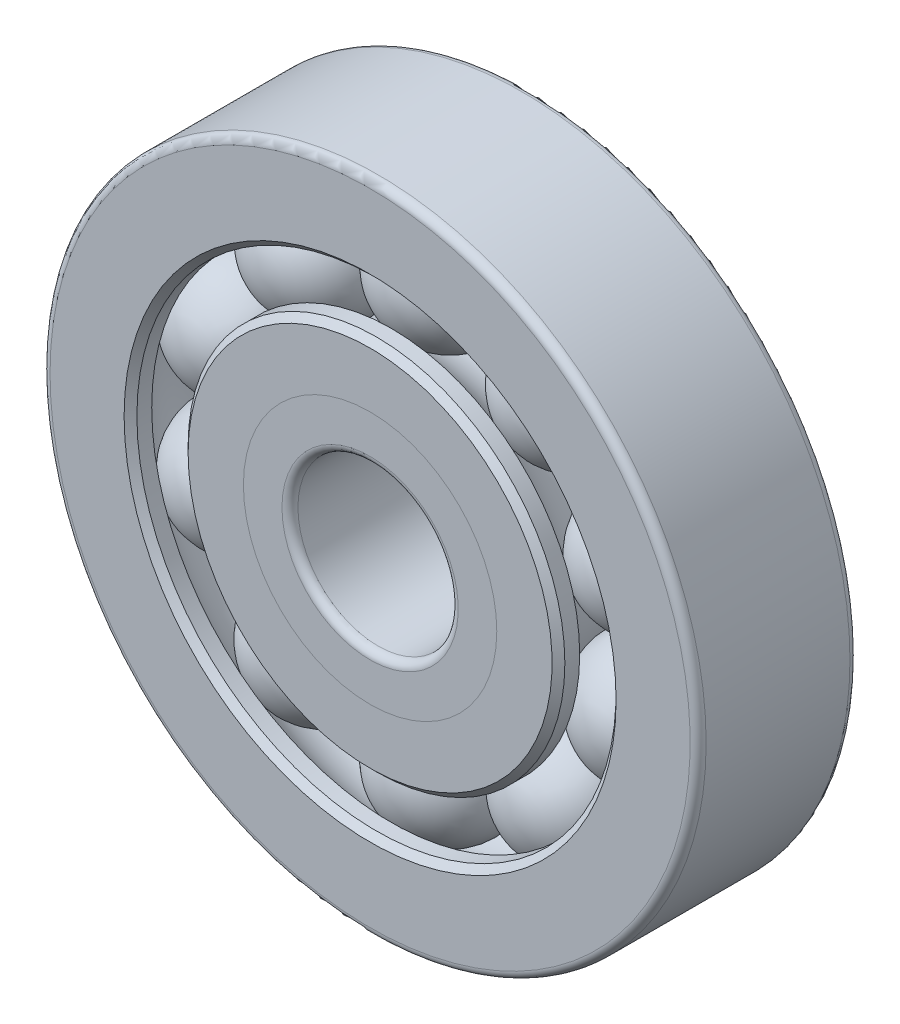
ISO-10303-21;
HEADER;
FILE_DESCRIPTION(('STEP AP214'),'2;1');
FILE_NAME('part.step','',(''),(''),'','','');
FILE_SCHEMA(('AUTOMOTIVE_DESIGN { 1 0 10303 214 1 1 1 1 }'));
ENDSEC;
DATA;
#1=APPLICATION_CONTEXT('core data for automotive mechanical design processes');
#2=APPLICATION_PROTOCOL_DEFINITION('international standard','automotive_design',2000,#1);
#3=PRODUCT_CONTEXT('',#1,'mechanical');
#4=PRODUCT('Part','Part','',(#3));
#5=PRODUCT_RELATED_PRODUCT_CATEGORY('part','',(#4));
#6=PRODUCT_DEFINITION_FORMATION('','',#4);
#7=PRODUCT_DEFINITION_CONTEXT('part definition',#1,'design');
#8=PRODUCT_DEFINITION('design','',#6,#7);
#9=PRODUCT_DEFINITION_SHAPE('','',#8);
#10=(LENGTH_UNIT() NAMED_UNIT(*) SI_UNIT(.MILLI.,.METRE.));
#11=(NAMED_UNIT(*) PLANE_ANGLE_UNIT() SI_UNIT($,.RADIAN.));
#12=(NAMED_UNIT(*) SI_UNIT($,.STERADIAN.) SOLID_ANGLE_UNIT());
#13=UNCERTAINTY_MEASURE_WITH_UNIT(LENGTH_MEASURE(1.E-05),#10,'distance_accuracy_value','');
#14=(GEOMETRIC_REPRESENTATION_CONTEXT(3) GLOBAL_UNCERTAINTY_ASSIGNED_CONTEXT((#13)) GLOBAL_UNIT_ASSIGNED_CONTEXT((#10,
#11,#12)) REPRESENTATION_CONTEXT('',''));
#15=CARTESIAN_POINT('',(0.,0.,0.));
#16=DIRECTION('',(0.,0.,1.));
#17=DIRECTION('',(1.,0.,0.));
#18=AXIS2_PLACEMENT_3D('',#15,#16,#17);
#19=CARTESIAN_POINT('',(0.,0.,-3.9724));
#20=DIRECTION('',(0.,0.,1.));
#21=DIRECTION('',(1.,0.,0.));
#22=AXIS2_PLACEMENT_3D('',#19,#20,#21);
#23=CYLINDRICAL_SURFACE('',#22,6.28311333333333);
#24=CARTESIAN_POINT('',(0.,0.,-3.9624));
#25=DIRECTION('',(0.,0.,1.));
#26=DIRECTION('',(1.,0.,0.));
#27=AXIS2_PLACEMENT_3D('',#24,#25,#26);
#28=CIRCLE('',#27,6.28311333333333);
#29=CARTESIAN_POINT('',(6.28311333333333,0.,-3.9624));
#30=VERTEX_POINT('',#29);
#31=EDGE_CURVE('E62',#30,#30,#28,.T.);
#32=ORIENTED_EDGE('',*,*,#31,.T.);
#33=EDGE_LOOP('',(#32));
#34=FACE_BOUND('',#33,.T.);
#35=CARTESIAN_POINT('',(0.,0.,3.9624));
#36=DIRECTION('',(0.,0.,-1.));
#37=DIRECTION('',(-1.,0.,0.));
#38=AXIS2_PLACEMENT_3D('',#35,#36,#37);
#39=CIRCLE('',#38,6.28311333333333);
#40=CARTESIAN_POINT('',(-6.28311333333333,0.,3.9624));
#41=VERTEX_POINT('',#40);
#42=EDGE_CURVE('E50',#41,#41,#39,.T.);
#43=ORIENTED_EDGE('',*,*,#42,.T.);
#44=EDGE_LOOP('',(#43));
#45=FACE_BOUND('',#44,.T.);
#46=ADVANCED_FACE('F46',(#34,#45),#23,.T.);
#47=CARTESIAN_POINT('',(0.,3.9751,-3.9624));
#48=DIRECTION('',(0.,0.,1.));
#49=DIRECTION('',(1.,0.,0.));
#50=AXIS2_PLACEMENT_3D('',#47,#48,#49);
#51=PLANE('',#50);
#52=CARTESIAN_POINT('',(0.,0.,-3.9624));
#53=DIRECTION('',(0.,0.,1.));
#54=DIRECTION('',(1.,0.,0.));
#55=AXIS2_PLACEMENT_3D('',#52,#53,#54);
#56=CIRCLE('',#55,4.37134);
#57=CARTESIAN_POINT('',(4.37134,0.,-3.9624));
#58=VERTEX_POINT('',#57);
#59=EDGE_CURVE('E11',#58,#58,#56,.T.);
#60=ORIENTED_EDGE('',*,*,#59,.T.);
#61=EDGE_LOOP('',(#60));
#62=FACE_BOUND('',#61,.T.);
#63=ORIENTED_EDGE('',*,*,#31,.F.);
#64=EDGE_LOOP('',(#63));
#65=FACE_BOUND('',#64,.T.);
#66=ADVANCED_FACE('F48',(#62,#65),#51,.F.);
#67=CARTESIAN_POINT('',(0.,9.34212,3.9624));
#68=DIRECTION('',(0.,0.,-1.));
#69=DIRECTION('',(-1.,0.,0.));
#70=AXIS2_PLACEMENT_3D('',#67,#68,#69);
#71=PLANE('',#70);
#72=CARTESIAN_POINT('',(0.,0.,3.9624));
#73=DIRECTION('',(0.,0.,-1.));
#74=DIRECTION('',(-1.,0.,0.));
#75=AXIS2_PLACEMENT_3D('',#72,#73,#74);
#76=CIRCLE('',#75,4.37134);
#77=CARTESIAN_POINT('',(-4.37134,0.,3.9624));
#78=VERTEX_POINT('',#77);
#79=EDGE_CURVE('E64',#78,#78,#76,.T.);
#80=ORIENTED_EDGE('',*,*,#79,.T.);
#81=EDGE_LOOP('',(#80));
#82=FACE_BOUND('',#81,.T.);
#83=ORIENTED_EDGE('',*,*,#42,.F.);
#84=EDGE_LOOP('',(#83));
#85=FACE_BOUND('',#84,.T.);
#86=ADVANCED_FACE('F73',(#82,#85),#71,.F.);
#87=CARTESIAN_POINT('',(0.,0.,3.9624));
#88=DIRECTION('',(0.,0.,1.));
#89=DIRECTION('',(1.,0.,0.));
#90=AXIS2_PLACEMENT_3D('',#87,#88,#89);
#91=CYLINDRICAL_SURFACE('',#90,3.9751);
#92=CARTESIAN_POINT('',(0.,0.,-3.56616));
#93=DIRECTION('',(0.,0.,1.));
#94=DIRECTION('',(1.,0.,0.));
#95=AXIS2_PLACEMENT_3D('',#92,#93,#94);
#96=CIRCLE('',#95,3.9751);
#97=CARTESIAN_POINT('',(3.9751,0.,-3.56616));
#98=VERTEX_POINT('',#97);
#99=EDGE_CURVE('E59',#98,#98,#96,.F.);
#100=ORIENTED_EDGE('',*,*,#99,.T.);
#101=EDGE_LOOP('',(#100));
#102=FACE_BOUND('',#101,.T.);
#103=CARTESIAN_POINT('',(0.,0.,3.56616));
#104=DIRECTION('',(0.,0.,-1.));
#105=DIRECTION('',(-1.,0.,0.));
#106=AXIS2_PLACEMENT_3D('',#103,#104,#105);
#107=CIRCLE('',#106,3.9751);
#108=CARTESIAN_POINT('',(-3.9751,0.,3.56616));
#109=VERTEX_POINT('',#108);
#110=EDGE_CURVE('E54',#109,#109,#107,.F.);
#111=ORIENTED_EDGE('',*,*,#110,.T.);
#112=EDGE_LOOP('',(#111));
#113=FACE_BOUND('',#112,.T.);
#114=ADVANCED_FACE('F75',(#102,#113),#91,.F.);
#115=CARTESIAN_POINT('',(0.,0.,-3.56616));
#116=DIRECTION('',(0.,0.,1.));
#117=DIRECTION('',(1.,0.,0.));
#118=AXIS2_PLACEMENT_3D('',#115,#116,#117);
#119=TOROIDAL_SURFACE('',#118,4.37134,0.39624);
#120=ORIENTED_EDGE('',*,*,#99,.F.);
#121=EDGE_LOOP('',(#120));
#122=FACE_BOUND('',#121,.T.);
#123=ORIENTED_EDGE('',*,*,#59,.F.);
#124=EDGE_LOOP('',(#123));
#125=FACE_BOUND('',#124,.T.);
#126=ADVANCED_FACE('F81',(#122,#125),#119,.T.);
#127=CARTESIAN_POINT('',(0.,0.,3.56616));
#128=DIRECTION('',(0.,0.,-1.));
#129=DIRECTION('',(-1.,0.,0.));
#130=AXIS2_PLACEMENT_3D('',#127,#128,#129);
#131=TOROIDAL_SURFACE('',#130,4.37134,0.39624);
#132=ORIENTED_EDGE('',*,*,#79,.F.);
#133=EDGE_LOOP('',(#132));
#134=FACE_BOUND('',#133,.T.);
#135=ORIENTED_EDGE('',*,*,#110,.F.);
#136=EDGE_LOOP('',(#135));
#137=FACE_BOUND('',#136,.T.);
#138=ADVANCED_FACE('F86',(#134,#137),#131,.T.);
#139=CLOSED_SHELL('',(#46,#66,#86,#114,#126,#138));
#140=MANIFOLD_SOLID_BREP('B2',#139);
#141=CARTESIAN_POINT('',(0.,0.,-3.9724));
#142=DIRECTION('',(0.,0.,1.));
#143=DIRECTION('',(1.,0.,0.));
#144=AXIS2_PLACEMENT_3D('',#141,#142,#143);
#145=CYLINDRICAL_SURFACE('',#144,6.28311333333333);
#146=CARTESIAN_POINT('',(0.,0.,3.9624));
#147=DIRECTION('',(0.,0.,-1.));
#148=DIRECTION('',(-1.,0.,0.));
#149=AXIS2_PLACEMENT_3D('',#146,#147,#148);
#150=CIRCLE('',#149,6.28311333333333);
#151=CARTESIAN_POINT('',(-6.28311333333333,0.,3.9624));
#152=VERTEX_POINT('',#151);
#153=EDGE_CURVE('E138',#152,#152,#150,.T.);
#154=ORIENTED_EDGE('',*,*,#153,.F.);
#155=EDGE_LOOP('',(#154));
#156=FACE_BOUND('',#155,.T.);
#157=CARTESIAN_POINT('',(0.,0.,-3.9624));
#158=DIRECTION('',(0.,0.,1.));
#159=DIRECTION('',(1.,0.,0.));
#160=AXIS2_PLACEMENT_3D('',#157,#158,#159);
#161=CIRCLE('',#160,6.28311333333333);
#162=CARTESIAN_POINT('',(6.28311333333333,0.,-3.9624));
#163=VERTEX_POINT('',#162);
#164=EDGE_CURVE('E45',#163,#163,#161,.T.);
#165=ORIENTED_EDGE('',*,*,#164,.F.);
#166=EDGE_LOOP('',(#165));
#167=FACE_BOUND('',#166,.T.);
#168=ADVANCED_FACE('F132',(#156,#167),#145,.F.);
#169=CARTESIAN_POINT('',(0.,0.,0.));
#170=DIRECTION('',(0.,0.,1.));
#171=DIRECTION('',(1.,0.,0.));
#172=AXIS2_PLACEMENT_3D('',#169,#170,#171);
#173=TOROIDAL_SURFACE('',#172,10.61212,3.175);
#174=CARTESIAN_POINT('',(0.,0.,-2.90993556629696));
#175=DIRECTION('',(0.,0.,1.));
#176=DIRECTION('',(1.,0.,0.));
#177=AXIS2_PLACEMENT_3D('',#174,#175,#176);
#178=CIRCLE('',#177,9.34212);
#179=CARTESIAN_POINT('',(9.34212,0.,-2.90993556629696));
#180=VERTEX_POINT('',#179);
#181=EDGE_CURVE('E160',#180,#180,#178,.T.);
#182=ORIENTED_EDGE('',*,*,#181,.T.);
#183=EDGE_LOOP('',(#182));
#184=FACE_BOUND('',#183,.T.);
#185=CARTESIAN_POINT('',(0.,0.,2.90993556629696));
#186=DIRECTION('',(0.,0.,-1.));
#187=DIRECTION('',(-1.,0.,0.));
#188=AXIS2_PLACEMENT_3D('',#185,#186,#187);
#189=CIRCLE('',#188,9.34212);
#190=CARTESIAN_POINT('',(-9.34212,0.,2.90993556629696));
#191=VERTEX_POINT('',#190);
#192=EDGE_CURVE('E157',#191,#191,#189,.T.);
#193=ORIENTED_EDGE('',*,*,#192,.T.);
#194=EDGE_LOOP('',(#193));
#195=FACE_BOUND('',#194,.T.);
#196=ADVANCED_FACE('F164',(#184,#195),#173,.F.);
#197=CARTESIAN_POINT('',(0.,0.,3.9624));
#198=DIRECTION('',(0.,0.,1.));
#199=DIRECTION('',(1.,0.,0.));
#200=AXIS2_PLACEMENT_3D('',#197,#198,#199);
#201=CYLINDRICAL_SURFACE('',#200,9.34212);
#202=CARTESIAN_POINT('',(0.,0.,3.64540799999999));
#203=DIRECTION('',(0.,0.,-1.));
#204=DIRECTION('',(-1.,0.,0.));
#205=AXIS2_PLACEMENT_3D('',#202,#203,#204);
#206=CIRCLE('',#205,9.34212);
#207=CARTESIAN_POINT('',(-9.34212,0.,3.64540799999999));
#208=VERTEX_POINT('',#207);
#209=EDGE_CURVE('E142',#208,#208,#206,.T.);
#210=ORIENTED_EDGE('',*,*,#209,.T.);
#211=EDGE_LOOP('',(#210));
#212=FACE_BOUND('',#211,.T.);
#213=ORIENTED_EDGE('',*,*,#192,.F.);
#214=EDGE_LOOP('',(#213));
#215=FACE_BOUND('',#214,.T.);
#216=ADVANCED_FACE('F173',(#212,#215),#201,.T.);
#217=CARTESIAN_POINT('',(0.,0.,3.9624));
#218=DIRECTION('',(0.,0.,-1.));
#219=DIRECTION('',(-1.,0.,0.));
#220=AXIS2_PLACEMENT_3D('',#217,#218,#219);
#221=CONICAL_SURFACE('',#220,9.02512799999999,0.785398163397443);
#222=ORIENTED_EDGE('',*,*,#209,.F.);
#223=EDGE_LOOP('',(#222));
#224=FACE_BOUND('',#223,.T.);
#225=CARTESIAN_POINT('',(0.,0.,3.9624));
#226=DIRECTION('',(0.,0.,-1.));
#227=DIRECTION('',(-1.,0.,0.));
#228=AXIS2_PLACEMENT_3D('',#225,#226,#227);
#229=CIRCLE('',#228,9.02512799999999);
#230=CARTESIAN_POINT('',(-9.02512799999999,0.,3.9624));
#231=VERTEX_POINT('',#230);
#232=EDGE_CURVE('E146',#231,#231,#229,.F.);
#233=ORIENTED_EDGE('',*,*,#232,.F.);
#234=EDGE_LOOP('',(#233));
#235=FACE_BOUND('',#234,.T.);
#236=ADVANCED_FACE('F183',(#224,#235),#221,.T.);
#237=CARTESIAN_POINT('',(0.,9.34212,3.9624));
#238=DIRECTION('',(0.,0.,-1.));
#239=DIRECTION('',(-1.,0.,0.));
#240=AXIS2_PLACEMENT_3D('',#237,#238,#239);
#241=PLANE('',#240);
#242=ORIENTED_EDGE('',*,*,#153,.T.);
#243=EDGE_LOOP('',(#242));
#244=FACE_BOUND('',#243,.T.);
#245=ORIENTED_EDGE('',*,*,#232,.T.);
#246=EDGE_LOOP('',(#245));
#247=FACE_BOUND('',#246,.T.);
#248=ADVANCED_FACE('F170',(#244,#247),#241,.F.);
#249=CARTESIAN_POINT('',(0.,0.,-3.645408));
#250=DIRECTION('',(0.,0.,1.));
#251=DIRECTION('',(1.,0.,0.));
#252=AXIS2_PLACEMENT_3D('',#249,#250,#251);
#253=CIRCLE('',#252,9.34212);
#254=CARTESIAN_POINT('',(9.34212,0.,-3.645408));
#255=VERTEX_POINT('',#254);
#256=EDGE_CURVE('E154',#255,#255,#253,.T.);
#257=ORIENTED_EDGE('',*,*,#256,.T.);
#258=EDGE_LOOP('',(#257));
#259=FACE_BOUND('',#258,.T.);
#260=ORIENTED_EDGE('',*,*,#181,.F.);
#261=EDGE_LOOP('',(#260));
#262=FACE_BOUND('',#261,.T.);
#263=ADVANCED_FACE('F167',(#259,#262),#201,.T.);
#264=CARTESIAN_POINT('',(0.,0.,-3.645408));
#265=DIRECTION('',(0.,0.,1.));
#266=DIRECTION('',(1.,0.,0.));
#267=AXIS2_PLACEMENT_3D('',#264,#265,#266);
#268=CONICAL_SURFACE('',#267,9.34212,0.785398163397454);
#269=CARTESIAN_POINT('',(0.,0.,-3.9624));
#270=DIRECTION('',(0.,0.,1.));
#271=DIRECTION('',(1.,0.,0.));
#272=AXIS2_PLACEMENT_3D('',#269,#270,#271);
#273=CIRCLE('',#272,9.025128);
#274=CARTESIAN_POINT('',(9.025128,0.,-3.9624));
#275=VERTEX_POINT('',#274);
#276=EDGE_CURVE('E151',#275,#275,#273,.F.);
#277=ORIENTED_EDGE('',*,*,#276,.F.);
#278=EDGE_LOOP('',(#277));
#279=FACE_BOUND('',#278,.T.);
#280=ORIENTED_EDGE('',*,*,#256,.F.);
#281=EDGE_LOOP('',(#280));
#282=FACE_BOUND('',#281,.T.);
#283=ADVANCED_FACE('F169',(#279,#282),#268,.T.);
#284=CARTESIAN_POINT('',(0.,3.9751,-3.9624));
#285=DIRECTION('',(0.,0.,1.));
#286=DIRECTION('',(1.,0.,0.));
#287=AXIS2_PLACEMENT_3D('',#284,#285,#286);
#288=PLANE('',#287);
#289=ORIENTED_EDGE('',*,*,#164,.T.);
#290=EDGE_LOOP('',(#289));
#291=FACE_BOUND('',#290,.T.);
#292=ORIENTED_EDGE('',*,*,#276,.T.);
#293=EDGE_LOOP('',(#292));
#294=FACE_BOUND('',#293,.T.);
#295=ADVANCED_FACE('F179',(#291,#294),#288,.F.);
#296=CLOSED_SHELL('',(#168,#196,#216,#236,#248,#263,#283,#295));
#297=MANIFOLD_SOLID_BREP('B6',#296);
#298=CARTESIAN_POINT('',(-6.23764763155789,8.58538542634635,0.));
#299=DIRECTION('',(0.,0.,1.));
#300=DIRECTION('',(-0.587785252292462,0.809016994374955,0.));
#301=AXIS2_PLACEMENT_3D('',#298,#299,#300);
#302=SPHERICAL_SURFACE('',#301,3.175);
#303=CARTESIAN_POINT('',(-6.23764763155789,8.58538542634635,3.175));
#304=VERTEX_POINT('',#303);
#305=VERTEX_LOOP('',#304);
#306=FACE_BOUND('',#305,.T.);
#307=ADVANCED_FACE('F243',(#306),#302,.T.);
#308=CLOSED_SHELL('',(#307));
#309=MANIFOLD_SOLID_BREP('B40',#308);
#310=CARTESIAN_POINT('',(-10.0927258777061,3.27932542634638,0.));
#311=DIRECTION('',(0.,0.,1.));
#312=DIRECTION('',(-0.95105651629515,0.309016994374958,0.));
#313=AXIS2_PLACEMENT_3D('',#310,#311,#312);
#314=SPHERICAL_SURFACE('',#313,3.175);
#315=CARTESIAN_POINT('',(-10.0927258777061,3.27932542634638,3.175));
#316=VERTEX_POINT('',#315);
#317=VERTEX_LOOP('',#316);
#318=FACE_BOUND('',#317,.T.);
#319=ADVANCED_FACE('F262',(#318),#314,.T.);
#320=CLOSED_SHELL('',(#319));
#321=MANIFOLD_SOLID_BREP('B128',#320);
#322=CARTESIAN_POINT('',(-10.0927258777062,-3.27932542634617,0.));
#323=DIRECTION('',(0.,0.,1.));
#324=DIRECTION('',(-0.951056516295157,-0.309016994374938,0.));
#325=AXIS2_PLACEMENT_3D('',#322,#323,#324);
#326=SPHERICAL_SURFACE('',#325,3.175);
#327=CARTESIAN_POINT('',(-10.0927258777062,-3.27932542634617,3.175));
#328=VERTEX_POINT('',#327);
#329=VERTEX_LOOP('',#328);
#330=FACE_BOUND('',#329,.T.);
#331=ADVANCED_FACE('F281',(#330),#326,.T.);
#332=CLOSED_SHELL('',(#331));
#333=MANIFOLD_SOLID_BREP('B239',#332);
#334=CARTESIAN_POINT('',(-6.23764763155808,-8.58538542634621,0.));
#335=DIRECTION('',(0.,0.,1.));
#336=DIRECTION('',(-0.58778525229248,-0.809016994374942,0.));
#337=AXIS2_PLACEMENT_3D('',#334,#335,#336);
#338=SPHERICAL_SURFACE('',#337,3.175);
#339=CARTESIAN_POINT('',(-6.23764763155808,-8.58538542634621,3.175));
#340=VERTEX_POINT('',#339);
#341=VERTEX_LOOP('',#340);
#342=FACE_BOUND('',#341,.T.);
#343=ADVANCED_FACE('F300',(#342),#338,.T.);
#344=CLOSED_SHELL('',(#343));
#345=MANIFOLD_SOLID_BREP('B258',#344);
#346=CARTESIAN_POINT('',(0.,-10.61212,0.));
#347=DIRECTION('',(0.,0.,1.));
#348=DIRECTION('',(0.,-1.,0.));
#349=AXIS2_PLACEMENT_3D('',#346,#347,#348);
#350=SPHERICAL_SURFACE('',#349,3.175);
#351=CARTESIAN_POINT('',(0.,-10.61212,3.175));
#352=VERTEX_POINT('',#351);
#353=VERTEX_LOOP('',#352);
#354=FACE_BOUND('',#353,.T.);
#355=ADVANCED_FACE('F319',(#354),#350,.T.);
#356=CLOSED_SHELL('',(#355));
#357=MANIFOLD_SOLID_BREP('B277',#356);
#358=CARTESIAN_POINT('',(6.23764763155795,-8.5853854263463,0.));
#359=DIRECTION('',(0.,0.,1.));
#360=DIRECTION('',(0.587785252292469,-0.809016994374951,0.));
#361=AXIS2_PLACEMENT_3D('',#358,#359,#360);
#362=SPHERICAL_SURFACE('',#361,3.175);
#363=CARTESIAN_POINT('',(6.23764763155795,-8.5853854263463,3.175));
#364=VERTEX_POINT('',#363);
#365=VERTEX_LOOP('',#364);
#366=FACE_BOUND('',#365,.T.);
#367=ADVANCED_FACE('F338',(#366),#362,.T.);
#368=CLOSED_SHELL('',(#367));
#369=MANIFOLD_SOLID_BREP('B296',#368);
#370=CARTESIAN_POINT('',(10.0927258777061,-3.27932542634631,0.));
#371=DIRECTION('',(0.,0.,1.));
#372=DIRECTION('',(0.951056516295152,-0.309016994374952,0.));
#373=AXIS2_PLACEMENT_3D('',#370,#371,#372);
#374=SPHERICAL_SURFACE('',#373,3.175);
#375=CARTESIAN_POINT('',(10.0927258777061,-3.27932542634631,3.175));
#376=VERTEX_POINT('',#375);
#377=VERTEX_LOOP('',#376);
#378=FACE_BOUND('',#377,.T.);
#379=ADVANCED_FACE('F357',(#378),#374,.T.);
#380=CLOSED_SHELL('',(#379));
#381=MANIFOLD_SOLID_BREP('B315',#380);
#382=CARTESIAN_POINT('',(10.0927258777061,3.27932542634624,0.));
#383=DIRECTION('',(0.,0.,1.));
#384=DIRECTION('',(0.951056516295155,0.309016994374945,0.));
#385=AXIS2_PLACEMENT_3D('',#382,#383,#384);
#386=SPHERICAL_SURFACE('',#385,3.175);
#387=CARTESIAN_POINT('',(10.0927258777061,3.27932542634624,3.175));
#388=VERTEX_POINT('',#387);
#389=VERTEX_LOOP('',#388);
#390=FACE_BOUND('',#389,.T.);
#391=ADVANCED_FACE('F376',(#390),#386,.T.);
#392=CLOSED_SHELL('',(#391));
#393=MANIFOLD_SOLID_BREP('B334',#392);
#394=CARTESIAN_POINT('',(6.23764763155801,8.58538542634626,0.));
#395=DIRECTION('',(0.,0.,1.));
#396=DIRECTION('',(0.587785252292474,0.809016994374947,0.));
#397=AXIS2_PLACEMENT_3D('',#394,#395,#396);
#398=SPHERICAL_SURFACE('',#397,3.175);
#399=CARTESIAN_POINT('',(6.23764763155801,8.58538542634626,3.175));
#400=VERTEX_POINT('',#399);
#401=VERTEX_LOOP('',#400);
#402=FACE_BOUND('',#401,.T.);
#403=ADVANCED_FACE('F395',(#402),#398,.T.);
#404=CLOSED_SHELL('',(#403));
#405=MANIFOLD_SOLID_BREP('B353',#404);
#406=CARTESIAN_POINT('',(0.,10.61212,0.));
#407=DIRECTION('',(0.,0.,1.));
#408=DIRECTION('',(0.,1.,0.));
#409=AXIS2_PLACEMENT_3D('',#406,#407,#408);
#410=SPHERICAL_SURFACE('',#409,3.175);
#411=CARTESIAN_POINT('',(0.,10.61212,3.175));
#412=VERTEX_POINT('',#411);
#413=VERTEX_LOOP('',#412);
#414=FACE_BOUND('',#413,.T.);
#415=ADVANCED_FACE('F415',(#414),#410,.T.);
#416=CLOSED_SHELL('',(#415));
#417=MANIFOLD_SOLID_BREP('B372',#416);
#418=CARTESIAN_POINT('',(0.,0.,3.9624));
#419=DIRECTION('',(0.,0.,1.));
#420=DIRECTION('',(1.,0.,0.));
#421=AXIS2_PLACEMENT_3D('',#418,#419,#420);
#422=CYLINDRICAL_SURFACE('',#421,11.88212);
#423=CARTESIAN_POINT('',(0.,0.,3.645408));
#424=DIRECTION('',(0.,0.,-1.));
#425=DIRECTION('',(-1.,0.,0.));
#426=AXIS2_PLACEMENT_3D('',#423,#424,#425);
#427=CIRCLE('',#426,11.88212);
#428=CARTESIAN_POINT('',(-11.88212,0.,3.645408));
#429=VERTEX_POINT('',#428);
#430=EDGE_CURVE('E433',#429,#429,#427,.F.);
#431=ORIENTED_EDGE('',*,*,#430,.T.);
#432=EDGE_LOOP('',(#431));
#433=FACE_BOUND('',#432,.T.);
#434=CARTESIAN_POINT('',(0.,0.,2.90993556629696));
#435=DIRECTION('',(0.,0.,-1.));
#436=DIRECTION('',(-1.,0.,0.));
#437=AXIS2_PLACEMENT_3D('',#434,#435,#436);
#438=CIRCLE('',#437,11.88212);
#439=CARTESIAN_POINT('',(-11.88212,0.,2.90993556629696));
#440=VERTEX_POINT('',#439);
#441=EDGE_CURVE('E458',#440,#440,#438,.F.);
#442=ORIENTED_EDGE('',*,*,#441,.F.);
#443=EDGE_LOOP('',(#442));
#444=FACE_BOUND('',#443,.T.);
#445=ADVANCED_FACE('F426',(#433,#444),#422,.F.);
#446=CARTESIAN_POINT('',(0.,0.,-3.645408));
#447=DIRECTION('',(0.,0.,1.));
#448=DIRECTION('',(1.,0.,0.));
#449=AXIS2_PLACEMENT_3D('',#446,#447,#448);
#450=CIRCLE('',#449,11.88212);
#451=CARTESIAN_POINT('',(11.88212,0.,-3.645408));
#452=VERTEX_POINT('',#451);
#453=EDGE_CURVE('E437',#452,#452,#450,.F.);
#454=ORIENTED_EDGE('',*,*,#453,.T.);
#455=EDGE_LOOP('',(#454));
#456=FACE_BOUND('',#455,.T.);
#457=CARTESIAN_POINT('',(0.,0.,-2.90993556629696));
#458=DIRECTION('',(0.,0.,1.));
#459=DIRECTION('',(1.,0.,0.));
#460=AXIS2_PLACEMENT_3D('',#457,#458,#459);
#461=CIRCLE('',#460,11.88212);
#462=CARTESIAN_POINT('',(11.88212,0.,-2.90993556629696));
#463=VERTEX_POINT('',#462);
#464=EDGE_CURVE('E461',#463,#463,#461,.F.);
#465=ORIENTED_EDGE('',*,*,#464,.F.);
#466=EDGE_LOOP('',(#465));
#467=FACE_BOUND('',#466,.T.);
#468=ADVANCED_FACE('F468',(#456,#467),#422,.F.);
#469=CARTESIAN_POINT('',(0.,0.,3.9624));
#470=DIRECTION('',(0.,0.,1.));
#471=DIRECTION('',(1.,0.,0.));
#472=AXIS2_PLACEMENT_3D('',#469,#470,#471);
#473=CYLINDRICAL_SURFACE('',#472,16.2687);
#474=CARTESIAN_POINT('',(0.,0.,-3.56616));
#475=DIRECTION('',(0.,0.,1.));
#476=DIRECTION('',(1.,0.,0.));
#477=AXIS2_PLACEMENT_3D('',#474,#475,#476);
#478=CIRCLE('',#477,16.2687);
#479=CARTESIAN_POINT('',(16.2687,0.,-3.56616));
#480=VERTEX_POINT('',#479);
#481=EDGE_CURVE('E452',#480,#480,#478,.T.);
#482=ORIENTED_EDGE('',*,*,#481,.T.);
#483=EDGE_LOOP('',(#482));
#484=FACE_BOUND('',#483,.T.);
#485=CARTESIAN_POINT('',(0.,0.,3.56616));
#486=DIRECTION('',(0.,0.,-1.));
#487=DIRECTION('',(-1.,0.,0.));
#488=AXIS2_PLACEMENT_3D('',#485,#486,#487);
#489=CIRCLE('',#488,16.2687);
#490=CARTESIAN_POINT('',(-16.2687,0.,3.56616));
#491=VERTEX_POINT('',#490);
#492=EDGE_CURVE('E455',#491,#491,#489,.T.);
#493=ORIENTED_EDGE('',*,*,#492,.T.);
#494=EDGE_LOOP('',(#493));
#495=FACE_BOUND('',#494,.T.);
#496=ADVANCED_FACE('F470',(#484,#495),#473,.T.);
#497=CARTESIAN_POINT('',(0.,16.2687,3.9624));
#498=DIRECTION('',(0.,0.,-1.));
#499=DIRECTION('',(-1.,0.,0.));
#500=AXIS2_PLACEMENT_3D('',#497,#498,#499);
#501=PLANE('',#500);
#502=CARTESIAN_POINT('',(0.,0.,3.9624));
#503=DIRECTION('',(0.,0.,-1.));
#504=DIRECTION('',(-1.,0.,0.));
#505=AXIS2_PLACEMENT_3D('',#502,#503,#504);
#506=CIRCLE('',#505,12.199112);
#507=CARTESIAN_POINT('',(-12.199112,0.,3.9624));
#508=VERTEX_POINT('',#507);
#509=EDGE_CURVE('E414',#508,#508,#506,.T.);
#510=ORIENTED_EDGE('',*,*,#509,.T.);
#511=EDGE_LOOP('',(#510));
#512=FACE_BOUND('',#511,.T.);
#513=CARTESIAN_POINT('',(0.,0.,3.9624));
#514=DIRECTION('',(0.,0.,-1.));
#515=DIRECTION('',(-1.,0.,0.));
#516=AXIS2_PLACEMENT_3D('',#513,#514,#515);
#517=CIRCLE('',#516,15.87246);
#518=CARTESIAN_POINT('',(-15.87246,0.,3.9624));
#519=VERTEX_POINT('',#518);
#520=EDGE_CURVE('E446',#519,#519,#517,.F.);
#521=ORIENTED_EDGE('',*,*,#520,.T.);
#522=EDGE_LOOP('',(#521));
#523=FACE_BOUND('',#522,.T.);
#524=ADVANCED_FACE('F478',(#512,#523),#501,.F.);
#525=CARTESIAN_POINT('',(0.,11.88212,-3.9624));
#526=DIRECTION('',(0.,0.,1.));
#527=DIRECTION('',(1.,0.,0.));
#528=AXIS2_PLACEMENT_3D('',#525,#526,#527);
#529=PLANE('',#528);
#530=CARTESIAN_POINT('',(0.,0.,-3.9624));
#531=DIRECTION('',(0.,0.,1.));
#532=DIRECTION('',(1.,0.,0.));
#533=AXIS2_PLACEMENT_3D('',#530,#531,#532);
#534=CIRCLE('',#533,12.199112);
#535=CARTESIAN_POINT('',(12.199112,0.,-3.9624));
#536=VERTEX_POINT('',#535);
#537=EDGE_CURVE('E441',#536,#536,#534,.T.);
#538=ORIENTED_EDGE('',*,*,#537,.T.);
#539=EDGE_LOOP('',(#538));
#540=FACE_BOUND('',#539,.T.);
#541=CARTESIAN_POINT('',(0.,0.,-3.9624));
#542=DIRECTION('',(0.,0.,1.));
#543=DIRECTION('',(1.,0.,0.));
#544=AXIS2_PLACEMENT_3D('',#541,#542,#543);
#545=CIRCLE('',#544,15.87246);
#546=CARTESIAN_POINT('',(15.87246,0.,-3.9624));
#547=VERTEX_POINT('',#546);
#548=EDGE_CURVE('E449',#547,#547,#545,.F.);
#549=ORIENTED_EDGE('',*,*,#548,.T.);
#550=EDGE_LOOP('',(#549));
#551=FACE_BOUND('',#550,.T.);
#552=ADVANCED_FACE('F483',(#540,#551),#529,.F.);
#553=CARTESIAN_POINT('',(0.,0.,0.));
#554=DIRECTION('',(0.,0.,1.));
#555=DIRECTION('',(1.,0.,0.));
#556=AXIS2_PLACEMENT_3D('',#553,#554,#555);
#557=TOROIDAL_SURFACE('',#556,10.61212,3.175);
#558=ORIENTED_EDGE('',*,*,#464,.T.);
#559=EDGE_LOOP('',(#558));
#560=FACE_BOUND('',#559,.T.);
#561=ORIENTED_EDGE('',*,*,#441,.T.);
#562=EDGE_LOOP('',(#561));
#563=FACE_BOUND('',#562,.T.);
#564=ADVANCED_FACE('F465',(#560,#563),#557,.F.);
#565=CARTESIAN_POINT('',(0.,0.,-3.56616));
#566=DIRECTION('',(0.,0.,1.));
#567=DIRECTION('',(1.,0.,0.));
#568=AXIS2_PLACEMENT_3D('',#565,#566,#567);
#569=TOROIDAL_SURFACE('',#568,15.87246,0.39624);
#570=ORIENTED_EDGE('',*,*,#548,.F.);
#571=EDGE_LOOP('',(#570));
#572=FACE_BOUND('',#571,.T.);
#573=ORIENTED_EDGE('',*,*,#481,.F.);
#574=EDGE_LOOP('',(#573));
#575=FACE_BOUND('',#574,.T.);
#576=ADVANCED_FACE('F486',(#572,#575),#569,.T.);
#577=CARTESIAN_POINT('',(0.,0.,3.56616));
#578=DIRECTION('',(0.,0.,-1.));
#579=DIRECTION('',(-1.,0.,0.));
#580=AXIS2_PLACEMENT_3D('',#577,#578,#579);
#581=TOROIDAL_SURFACE('',#580,15.87246,0.39624);
#582=ORIENTED_EDGE('',*,*,#492,.F.);
#583=EDGE_LOOP('',(#582));
#584=FACE_BOUND('',#583,.T.);
#585=ORIENTED_EDGE('',*,*,#520,.F.);
#586=EDGE_LOOP('',(#585));
#587=FACE_BOUND('',#586,.T.);
#588=ADVANCED_FACE('F489',(#584,#587),#581,.T.);
#589=CARTESIAN_POINT('',(0.,0.,-3.9624));
#590=DIRECTION('',(0.,0.,-1.));
#591=DIRECTION('',(-1.,0.,0.));
#592=AXIS2_PLACEMENT_3D('',#589,#590,#591);
#593=CONICAL_SURFACE('',#592,12.199112,0.785398163397448);
#594=ORIENTED_EDGE('',*,*,#453,.F.);
#595=EDGE_LOOP('',(#594));
#596=FACE_BOUND('',#595,.T.);
#597=ORIENTED_EDGE('',*,*,#537,.F.);
#598=EDGE_LOOP('',(#597));
#599=FACE_BOUND('',#598,.T.);
#600=ADVANCED_FACE('F492',(#596,#599),#593,.F.);
#601=CARTESIAN_POINT('',(0.,0.,3.645408));
#602=DIRECTION('',(0.,0.,1.));
#603=DIRECTION('',(1.,0.,0.));
#604=AXIS2_PLACEMENT_3D('',#601,#602,#603);
#605=CONICAL_SURFACE('',#604,11.88212,0.785398163397456);
#606=ORIENTED_EDGE('',*,*,#509,.F.);
#607=EDGE_LOOP('',(#606));
#608=FACE_BOUND('',#607,.T.);
#609=ORIENTED_EDGE('',*,*,#430,.F.);
#610=EDGE_LOOP('',(#609));
#611=FACE_BOUND('',#610,.T.);
#612=ADVANCED_FACE('F428',(#608,#611),#605,.F.);
#613=CLOSED_SHELL('',(#445,#468,#496,#524,#552,#564,#576,#588,#600,#612));
#614=MANIFOLD_SOLID_BREP('B391',#613);
#615=ADVANCED_BREP_SHAPE_REPRESENTATION('',(#18,#140,#297,#309,#321,#333,#345,#357,#369,#381,
#393,#405,#417,#614),#14);
#616=SHAPE_DEFINITION_REPRESENTATION(#9,#615);
ENDSEC;
END-ISO-10303-21;
